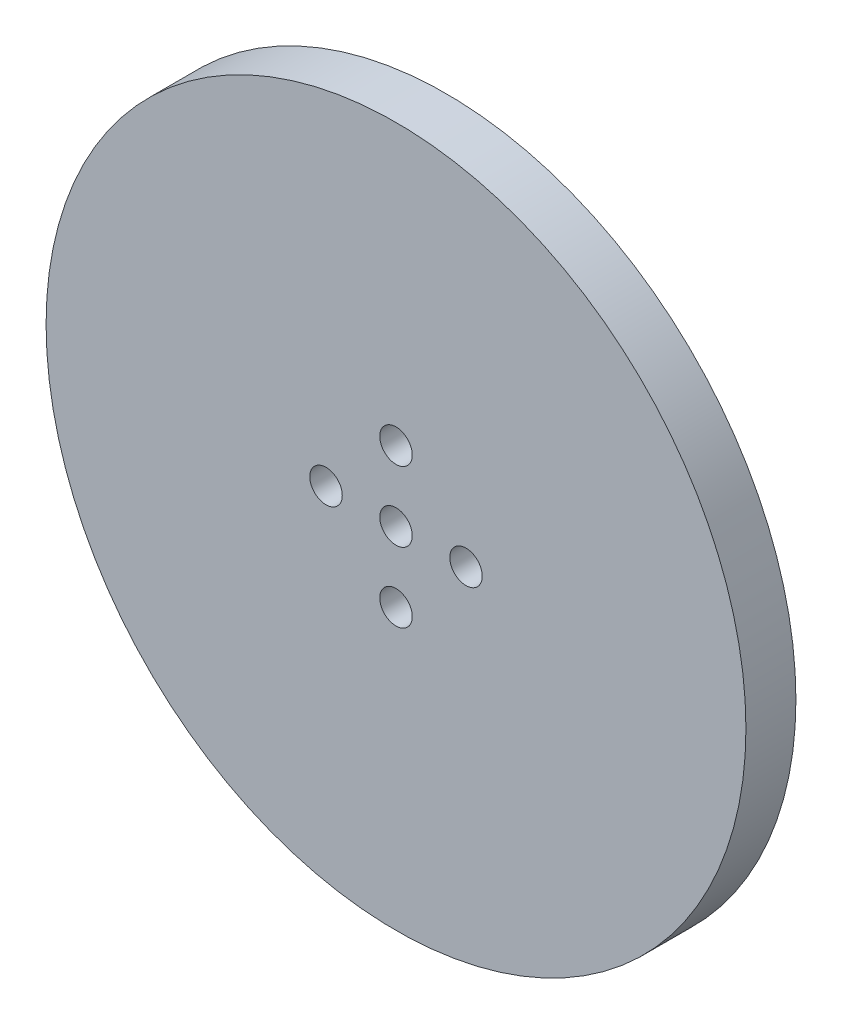
ISO-10303-21;
HEADER;
FILE_DESCRIPTION(('STEP AP214'),'2;1');
FILE_NAME('part.step','',(''),(''),'','','');
FILE_SCHEMA(('AUTOMOTIVE_DESIGN { 1 0 10303 214 1 1 1 1 }'));
ENDSEC;
DATA;
#1=APPLICATION_CONTEXT('core data for automotive mechanical design processes');
#2=APPLICATION_PROTOCOL_DEFINITION('international standard','automotive_design',2000,#1);
#3=PRODUCT_CONTEXT('',#1,'mechanical');
#4=PRODUCT('Part','Part','',(#3));
#5=PRODUCT_RELATED_PRODUCT_CATEGORY('part','',(#4));
#6=PRODUCT_DEFINITION_FORMATION('','',#4);
#7=PRODUCT_DEFINITION_CONTEXT('part definition',#1,'design');
#8=PRODUCT_DEFINITION('design','',#6,#7);
#9=PRODUCT_DEFINITION_SHAPE('','',#8);
#10=(LENGTH_UNIT() NAMED_UNIT(*) SI_UNIT(.MILLI.,.METRE.));
#11=(NAMED_UNIT(*) PLANE_ANGLE_UNIT() SI_UNIT($,.RADIAN.));
#12=(NAMED_UNIT(*) SI_UNIT($,.STERADIAN.) SOLID_ANGLE_UNIT());
#13=UNCERTAINTY_MEASURE_WITH_UNIT(LENGTH_MEASURE(1.E-05),#10,'distance_accuracy_value','');
#14=(GEOMETRIC_REPRESENTATION_CONTEXT(3) GLOBAL_UNCERTAINTY_ASSIGNED_CONTEXT((#13)) GLOBAL_UNIT_ASSIGNED_CONTEXT((#10,
#11,#12)) REPRESENTATION_CONTEXT('',''));
#15=CARTESIAN_POINT('',(0.,0.,0.));
#16=DIRECTION('',(0.,0.,1.));
#17=DIRECTION('',(1.,0.,0.));
#18=AXIS2_PLACEMENT_3D('',#15,#16,#17);
#19=CARTESIAN_POINT('',(0.,0.,5.));
#20=DIRECTION('',(0.,0.,1.));
#21=DIRECTION('',(1.,0.,0.));
#22=AXIS2_PLACEMENT_3D('',#19,#20,#21);
#23=PLANE('',#22);
#24=CARTESIAN_POINT('',(0.,-7.,5.));
#25=DIRECTION('',(0.,0.,1.));
#26=DIRECTION('',(1.,0.,0.));
#27=AXIS2_PLACEMENT_3D('',#24,#25,#26);
#28=CIRCLE('',#27,1.625);
#29=CARTESIAN_POINT('',(1.62499999999995,-7.,5.));
#30=VERTEX_POINT('',#29);
#31=EDGE_CURVE('E63',#30,#30,#28,.T.);
#32=ORIENTED_EDGE('',*,*,#31,.F.);
#33=EDGE_LOOP('',(#32));
#34=FACE_BOUND('',#33,.T.);
#35=CARTESIAN_POINT('',(0.,7.,5.));
#36=DIRECTION('',(0.,0.,1.));
#37=DIRECTION('',(1.,0.,0.));
#38=AXIS2_PLACEMENT_3D('',#35,#36,#37);
#39=CIRCLE('',#38,1.625);
#40=CARTESIAN_POINT('',(1.625,7.,5.));
#41=VERTEX_POINT('',#40);
#42=EDGE_CURVE('E52',#41,#41,#39,.T.);
#43=ORIENTED_EDGE('',*,*,#42,.F.);
#44=EDGE_LOOP('',(#43));
#45=FACE_BOUND('',#44,.T.);
#46=CARTESIAN_POINT('',(0.,0.,5.));
#47=DIRECTION('',(0.,0.,1.));
#48=DIRECTION('',(1.,0.,0.));
#49=AXIS2_PLACEMENT_3D('',#46,#47,#48);
#50=CIRCLE('',#49,35.);
#51=CARTESIAN_POINT('',(35.,0.,5.));
#52=VERTEX_POINT('',#51);
#53=EDGE_CURVE('E10',#52,#52,#50,.T.);
#54=ORIENTED_EDGE('',*,*,#53,.T.);
#55=EDGE_LOOP('',(#54));
#56=FACE_BOUND('',#55,.T.);
#57=CARTESIAN_POINT('',(0.,0.,5.));
#58=DIRECTION('',(0.,0.,1.));
#59=DIRECTION('',(1.,0.,0.));
#60=AXIS2_PLACEMENT_3D('',#57,#58,#59);
#61=CIRCLE('',#60,1.625);
#62=CARTESIAN_POINT('',(1.625,0.,5.));
#63=VERTEX_POINT('',#62);
#64=EDGE_CURVE('E48',#63,#63,#61,.T.);
#65=ORIENTED_EDGE('',*,*,#64,.F.);
#66=EDGE_LOOP('',(#65));
#67=FACE_BOUND('',#66,.T.);
#68=CARTESIAN_POINT('',(7.,0.,5.));
#69=DIRECTION('',(0.,0.,1.));
#70=DIRECTION('',(1.,0.,0.));
#71=AXIS2_PLACEMENT_3D('',#68,#69,#70);
#72=CIRCLE('',#71,1.625);
#73=CARTESIAN_POINT('',(8.625,0.,5.));
#74=VERTEX_POINT('',#73);
#75=EDGE_CURVE('E56',#74,#74,#72,.T.);
#76=ORIENTED_EDGE('',*,*,#75,.F.);
#77=EDGE_LOOP('',(#76));
#78=FACE_BOUND('',#77,.T.);
#79=CARTESIAN_POINT('',(-7.,0.,5.));
#80=DIRECTION('',(0.,0.,1.));
#81=DIRECTION('',(1.,0.,0.));
#82=AXIS2_PLACEMENT_3D('',#79,#80,#81);
#83=CIRCLE('',#82,1.625);
#84=CARTESIAN_POINT('',(-5.375,0.,5.));
#85=VERTEX_POINT('',#84);
#86=EDGE_CURVE('E72',#85,#85,#83,.T.);
#87=ORIENTED_EDGE('',*,*,#86,.F.);
#88=EDGE_LOOP('',(#87));
#89=FACE_BOUND('',#88,.T.);
#90=ADVANCED_FACE('F40',(#34,#45,#56,#67,#78,#89),#23,.T.);
#91=CARTESIAN_POINT('',(0.,0.,0.));
#92=DIRECTION('',(0.,0.,1.));
#93=DIRECTION('',(1.,0.,0.));
#94=AXIS2_PLACEMENT_3D('',#91,#92,#93);
#95=PLANE('',#94);
#96=CARTESIAN_POINT('',(0.,0.,0.));
#97=DIRECTION('',(0.,0.,1.));
#98=DIRECTION('',(1.,0.,0.));
#99=AXIS2_PLACEMENT_3D('',#96,#97,#98);
#100=CIRCLE('',#99,35.);
#101=CARTESIAN_POINT('',(35.,0.,0.));
#102=VERTEX_POINT('',#101);
#103=EDGE_CURVE('E41',#102,#102,#100,.T.);
#104=ORIENTED_EDGE('',*,*,#103,.F.);
#105=EDGE_LOOP('',(#104));
#106=FACE_BOUND('',#105,.T.);
#107=CARTESIAN_POINT('',(0.,0.,0.));
#108=DIRECTION('',(0.,0.,1.));
#109=DIRECTION('',(1.,0.,0.));
#110=AXIS2_PLACEMENT_3D('',#107,#108,#109);
#111=CIRCLE('',#110,1.625);
#112=CARTESIAN_POINT('',(1.625,0.,0.));
#113=VERTEX_POINT('',#112);
#114=EDGE_CURVE('E49',#113,#113,#111,.T.);
#115=ORIENTED_EDGE('',*,*,#114,.T.);
#116=EDGE_LOOP('',(#115));
#117=FACE_BOUND('',#116,.T.);
#118=CARTESIAN_POINT('',(0.,7.,0.));
#119=DIRECTION('',(0.,0.,1.));
#120=DIRECTION('',(1.,0.,0.));
#121=AXIS2_PLACEMENT_3D('',#118,#119,#120);
#122=CIRCLE('',#121,1.625);
#123=CARTESIAN_POINT('',(1.625,7.,0.));
#124=VERTEX_POINT('',#123);
#125=EDGE_CURVE('E57',#124,#124,#122,.T.);
#126=ORIENTED_EDGE('',*,*,#125,.T.);
#127=EDGE_LOOP('',(#126));
#128=FACE_BOUND('',#127,.T.);
#129=CARTESIAN_POINT('',(7.,0.,0.));
#130=DIRECTION('',(0.,0.,1.));
#131=DIRECTION('',(1.,0.,0.));
#132=AXIS2_PLACEMENT_3D('',#129,#130,#131);
#133=CIRCLE('',#132,1.625);
#134=CARTESIAN_POINT('',(8.625,0.,0.));
#135=VERTEX_POINT('',#134);
#136=EDGE_CURVE('E65',#135,#135,#133,.T.);
#137=ORIENTED_EDGE('',*,*,#136,.T.);
#138=EDGE_LOOP('',(#137));
#139=FACE_BOUND('',#138,.T.);
#140=CARTESIAN_POINT('',(0.,-7.,0.));
#141=DIRECTION('',(0.,0.,1.));
#142=DIRECTION('',(1.,0.,0.));
#143=AXIS2_PLACEMENT_3D('',#140,#141,#142);
#144=CIRCLE('',#143,1.625);
#145=CARTESIAN_POINT('',(1.62499999999995,-7.,0.));
#146=VERTEX_POINT('',#145);
#147=EDGE_CURVE('E67',#146,#146,#144,.T.);
#148=ORIENTED_EDGE('',*,*,#147,.T.);
#149=EDGE_LOOP('',(#148));
#150=FACE_BOUND('',#149,.T.);
#151=CARTESIAN_POINT('',(-7.,0.,0.));
#152=DIRECTION('',(0.,0.,1.));
#153=DIRECTION('',(1.,0.,0.));
#154=AXIS2_PLACEMENT_3D('',#151,#152,#153);
#155=CIRCLE('',#154,1.625);
#156=CARTESIAN_POINT('',(-5.375,0.,0.));
#157=VERTEX_POINT('',#156);
#158=EDGE_CURVE('E74',#157,#157,#155,.T.);
#159=ORIENTED_EDGE('',*,*,#158,.T.);
#160=EDGE_LOOP('',(#159));
#161=FACE_BOUND('',#160,.T.);
#162=ADVANCED_FACE('F83',(#106,#117,#128,#139,#150,#161),#95,.F.);
#163=CARTESIAN_POINT('',(0.,0.,5.));
#164=DIRECTION('',(0.,0.,-1.));
#165=DIRECTION('',(-1.,0.,0.));
#166=AXIS2_PLACEMENT_3D('',#163,#164,#165);
#167=CYLINDRICAL_SURFACE('',#166,35.);
#168=ORIENTED_EDGE('',*,*,#53,.F.);
#169=EDGE_LOOP('',(#168));
#170=FACE_BOUND('',#169,.T.);
#171=ORIENTED_EDGE('',*,*,#103,.T.);
#172=EDGE_LOOP('',(#171));
#173=FACE_BOUND('',#172,.T.);
#174=ADVANCED_FACE('F39',(#170,#173),#167,.T.);
#175=CARTESIAN_POINT('',(0.,0.,5.));
#176=DIRECTION('',(0.,0.,-1.));
#177=DIRECTION('',(-1.,0.,0.));
#178=AXIS2_PLACEMENT_3D('',#175,#176,#177);
#179=CYLINDRICAL_SURFACE('',#178,1.625);
#180=ORIENTED_EDGE('',*,*,#64,.T.);
#181=EDGE_LOOP('',(#180));
#182=FACE_BOUND('',#181,.T.);
#183=ORIENTED_EDGE('',*,*,#114,.F.);
#184=EDGE_LOOP('',(#183));
#185=FACE_BOUND('',#184,.T.);
#186=ADVANCED_FACE('F94',(#182,#185),#179,.F.);
#187=CARTESIAN_POINT('',(0.,7.,5.));
#188=DIRECTION('',(0.,0.,-1.));
#189=DIRECTION('',(-1.,0.,0.));
#190=AXIS2_PLACEMENT_3D('',#187,#188,#189);
#191=CYLINDRICAL_SURFACE('',#190,1.625);
#192=ORIENTED_EDGE('',*,*,#42,.T.);
#193=EDGE_LOOP('',(#192));
#194=FACE_BOUND('',#193,.T.);
#195=ORIENTED_EDGE('',*,*,#125,.F.);
#196=EDGE_LOOP('',(#195));
#197=FACE_BOUND('',#196,.T.);
#198=ADVANCED_FACE('F100',(#194,#197),#191,.F.);
#199=CARTESIAN_POINT('',(7.,0.,5.));
#200=DIRECTION('',(0.,0.,-1.));
#201=DIRECTION('',(-1.,0.,0.));
#202=AXIS2_PLACEMENT_3D('',#199,#200,#201);
#203=CYLINDRICAL_SURFACE('',#202,1.625);
#204=ORIENTED_EDGE('',*,*,#75,.T.);
#205=EDGE_LOOP('',(#204));
#206=FACE_BOUND('',#205,.T.);
#207=ORIENTED_EDGE('',*,*,#136,.F.);
#208=EDGE_LOOP('',(#207));
#209=FACE_BOUND('',#208,.T.);
#210=ADVANCED_FACE('F101',(#206,#209),#203,.F.);
#211=CARTESIAN_POINT('',(0.,-7.,5.));
#212=DIRECTION('',(0.,0.,-1.));
#213=DIRECTION('',(-1.,0.,0.));
#214=AXIS2_PLACEMENT_3D('',#211,#212,#213);
#215=CYLINDRICAL_SURFACE('',#214,1.625);
#216=ORIENTED_EDGE('',*,*,#31,.T.);
#217=EDGE_LOOP('',(#216));
#218=FACE_BOUND('',#217,.T.);
#219=ORIENTED_EDGE('',*,*,#147,.F.);
#220=EDGE_LOOP('',(#219));
#221=FACE_BOUND('',#220,.T.);
#222=ADVANCED_FACE('F104',(#218,#221),#215,.F.);
#223=CARTESIAN_POINT('',(-7.,0.,5.));
#224=DIRECTION('',(0.,0.,-1.));
#225=DIRECTION('',(-1.,0.,0.));
#226=AXIS2_PLACEMENT_3D('',#223,#224,#225);
#227=CYLINDRICAL_SURFACE('',#226,1.625);
#228=ORIENTED_EDGE('',*,*,#86,.T.);
#229=EDGE_LOOP('',(#228));
#230=FACE_BOUND('',#229,.T.);
#231=ORIENTED_EDGE('',*,*,#158,.F.);
#232=EDGE_LOOP('',(#231));
#233=FACE_BOUND('',#232,.T.);
#234=ADVANCED_FACE('F78',(#230,#233),#227,.F.);
#235=CLOSED_SHELL('',(#90,#162,#174,#186,#198,#210,#222,#234));
#236=MANIFOLD_SOLID_BREP('B2',#235);
#237=ADVANCED_BREP_SHAPE_REPRESENTATION('',(#18,#236),#14);
#238=SHAPE_DEFINITION_REPRESENTATION(#9,#237);
ENDSEC;
END-ISO-10303-21;
